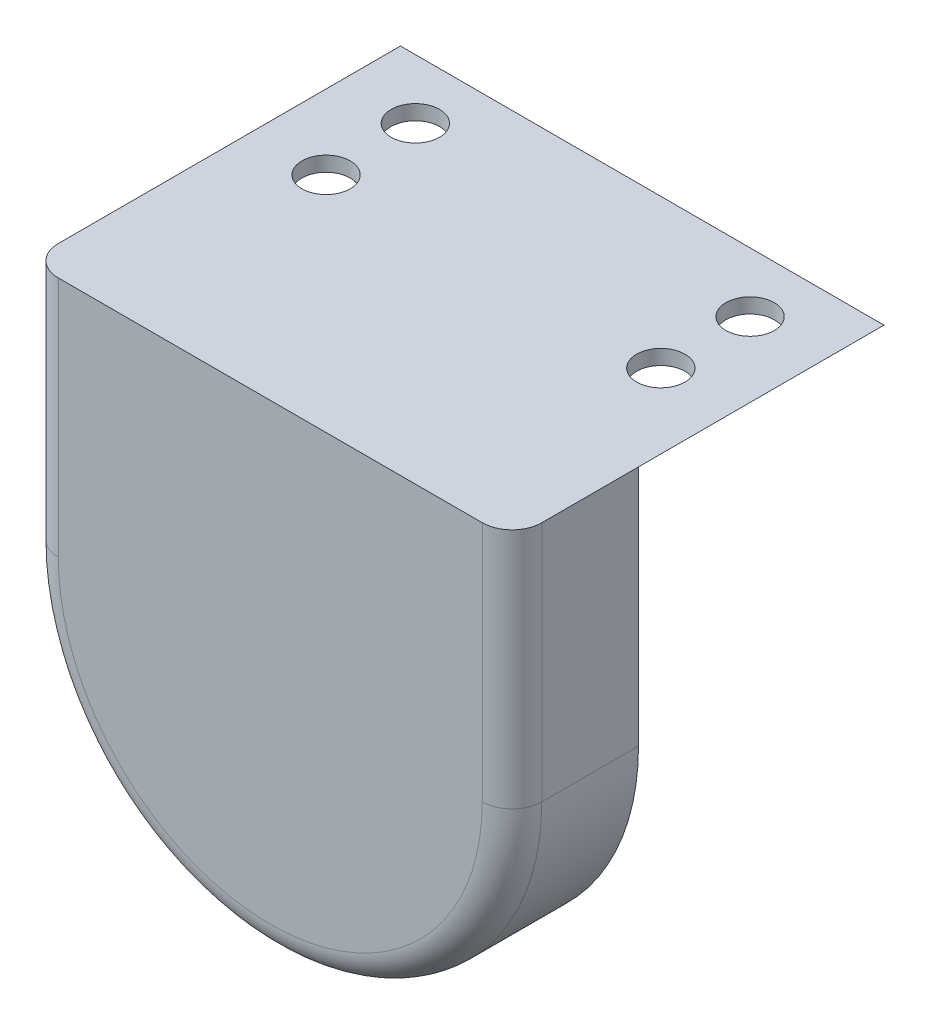
ISO-10303-21;
HEADER;
FILE_DESCRIPTION(('STEP AP214'),'2;1');
FILE_NAME('part.step','',(''),(''),'','','');
FILE_SCHEMA(('AUTOMOTIVE_DESIGN { 1 0 10303 214 1 1 1 1 }'));
ENDSEC;
DATA;
#1=APPLICATION_CONTEXT('core data for automotive mechanical design processes');
#2=APPLICATION_PROTOCOL_DEFINITION('international standard','automotive_design',2000,#1);
#3=PRODUCT_CONTEXT('',#1,'mechanical');
#4=PRODUCT('Part','Part','',(#3));
#5=PRODUCT_RELATED_PRODUCT_CATEGORY('part','',(#4));
#6=PRODUCT_DEFINITION_FORMATION('','',#4);
#7=PRODUCT_DEFINITION_CONTEXT('part definition',#1,'design');
#8=PRODUCT_DEFINITION('design','',#6,#7);
#9=PRODUCT_DEFINITION_SHAPE('','',#8);
#10=(LENGTH_UNIT() NAMED_UNIT(*) SI_UNIT(.MILLI.,.METRE.));
#11=(NAMED_UNIT(*) PLANE_ANGLE_UNIT() SI_UNIT($,.RADIAN.));
#12=(NAMED_UNIT(*) SI_UNIT($,.STERADIAN.) SOLID_ANGLE_UNIT());
#13=UNCERTAINTY_MEASURE_WITH_UNIT(LENGTH_MEASURE(1.E-05),#10,'distance_accuracy_value','');
#14=(GEOMETRIC_REPRESENTATION_CONTEXT(3) GLOBAL_UNCERTAINTY_ASSIGNED_CONTEXT((#13)) GLOBAL_UNIT_ASSIGNED_CONTEXT((#10,
#11,#12)) REPRESENTATION_CONTEXT('',''));
#15=CARTESIAN_POINT('',(0.,0.,0.));
#16=DIRECTION('',(0.,0.,1.));
#17=DIRECTION('',(1.,0.,0.));
#18=AXIS2_PLACEMENT_3D('',#15,#16,#17);
#19=CARTESIAN_POINT('',(-32.5,-50.,23.));
#20=DIRECTION('',(0.,0.,1.));
#21=DIRECTION('',(1.,0.,0.));
#22=AXIS2_PLACEMENT_3D('',#19,#20,#21);
#23=PLANE('',#22);
#24=DIRECTION('',(1.,0.,0.));
#25=VECTOR('',#24,1.);
#26=CARTESIAN_POINT('',(-32.5,-2.,23.));
#27=LINE('',#26,#25);
#28=CARTESIAN_POINT('',(-28.5,-2.,23.));
#29=VERTEX_POINT('',#28);
#30=CARTESIAN_POINT('',(28.5,-2.,23.));
#31=VERTEX_POINT('',#30);
#32=EDGE_CURVE('E133',#29,#31,#27,.T.);
#33=ORIENTED_EDGE('',*,*,#32,.T.);
#34=DIRECTION('',(0.,-1.,0.));
#35=VECTOR('',#34,1.);
#36=CARTESIAN_POINT('',(28.5,-50.,23.));
#37=LINE('',#36,#35);
#38=CARTESIAN_POINT('',(28.5,-32.5,23.));
#39=VERTEX_POINT('',#38);
#40=EDGE_CURVE('E207',#31,#39,#37,.T.);
#41=ORIENTED_EDGE('',*,*,#40,.T.);
#42=CARTESIAN_POINT('',(0.,-32.5,23.));
#43=DIRECTION('',(0.,0.,1.));
#44=DIRECTION('',(1.,0.,0.));
#45=AXIS2_PLACEMENT_3D('',#42,#43,#44);
#46=CIRCLE('',#45,28.5);
#47=CARTESIAN_POINT('',(-28.5,-32.5,23.));
#48=VERTEX_POINT('',#47);
#49=EDGE_CURVE('E204',#39,#48,#46,.F.);
#50=ORIENTED_EDGE('',*,*,#49,.T.);
#51=DIRECTION('',(0.,1.,0.));
#52=VECTOR('',#51,1.);
#53=CARTESIAN_POINT('',(-28.5,-50.,23.));
#54=LINE('',#53,#52);
#55=EDGE_CURVE('E209',#48,#29,#54,.T.);
#56=ORIENTED_EDGE('',*,*,#55,.T.);
#57=EDGE_LOOP('',(#33,#41,#50,#56));
#58=FACE_BOUND('',#57,.T.);
#59=ADVANCED_FACE('F18',(#58),#23,.F.);
#60=CARTESIAN_POINT('',(32.5,-50.,23.));
#61=DIRECTION('',(-1.,0.,0.));
#62=DIRECTION('',(0.,0.,1.));
#63=AXIS2_PLACEMENT_3D('',#60,#61,#62);
#64=PLANE('',#63);
#65=DIRECTION('',(0.,-1.,0.));
#66=VECTOR('',#65,1.);
#67=CARTESIAN_POINT('',(32.5,-32.5,8.));
#68=LINE('',#67,#66);
#69=CARTESIAN_POINT('',(32.5,0.,8.));
#70=VERTEX_POINT('',#69);
#71=CARTESIAN_POINT('',(32.5,-32.5,8.));
#72=VERTEX_POINT('',#71);
#73=EDGE_CURVE('E35',#70,#72,#68,.T.);
#74=ORIENTED_EDGE('',*,*,#73,.F.);
#75=DIRECTION('',(0.,0.,1.));
#76=VECTOR('',#75,1.);
#77=CARTESIAN_POINT('',(32.5,0.,23.));
#78=LINE('',#77,#76);
#79=CARTESIAN_POINT('',(32.5,0.,21.));
#80=VERTEX_POINT('',#79);
#81=EDGE_CURVE('E179',#70,#80,#78,.T.);
#82=ORIENTED_EDGE('',*,*,#81,.T.);
#83=DIRECTION('',(0.,-1.,0.));
#84=VECTOR('',#83,1.);
#85=CARTESIAN_POINT('',(32.5,-50.,21.));
#86=LINE('',#85,#84);
#87=CARTESIAN_POINT('',(32.5,-32.5,21.));
#88=VERTEX_POINT('',#87);
#89=EDGE_CURVE('E251',#80,#88,#86,.T.);
#90=ORIENTED_EDGE('',*,*,#89,.T.);
#91=DIRECTION('',(0.,0.,1.));
#92=VECTOR('',#91,1.);
#93=CARTESIAN_POINT('',(32.5,-32.5,23.));
#94=LINE('',#93,#92);
#95=EDGE_CURVE('E132',#88,#72,#94,.F.);
#96=ORIENTED_EDGE('',*,*,#95,.T.);
#97=EDGE_LOOP('',(#74,#82,#90,#96));
#98=FACE_BOUND('',#97,.T.);
#99=ADVANCED_FACE('F381',(#98),#64,.F.);
#100=CARTESIAN_POINT('',(32.5,-50.,25.));
#101=DIRECTION('',(0.,0.,-1.));
#102=DIRECTION('',(-1.,0.,0.));
#103=AXIS2_PLACEMENT_3D('',#100,#101,#102);
#104=PLANE('',#103);
#105=CARTESIAN_POINT('',(0.,-32.5,25.));
#106=DIRECTION('',(0.,0.,-1.));
#107=DIRECTION('',(-1.,0.,0.));
#108=AXIS2_PLACEMENT_3D('',#105,#106,#107);
#109=CIRCLE('',#108,28.5);
#110=CARTESIAN_POINT('',(-28.5,-32.5,25.));
#111=VERTEX_POINT('',#110);
#112=CARTESIAN_POINT('',(28.5,-32.5,25.));
#113=VERTEX_POINT('',#112);
#114=EDGE_CURVE('E201',#111,#113,#109,.F.);
#115=ORIENTED_EDGE('',*,*,#114,.T.);
#116=DIRECTION('',(0.,-1.,0.));
#117=VECTOR('',#116,1.);
#118=CARTESIAN_POINT('',(28.5,-50.,25.));
#119=LINE('',#118,#117);
#120=CARTESIAN_POINT('',(28.5,0.,25.));
#121=VERTEX_POINT('',#120);
#122=EDGE_CURVE('E239',#113,#121,#119,.F.);
#123=ORIENTED_EDGE('',*,*,#122,.T.);
#124=DIRECTION('',(-1.,0.,0.));
#125=VECTOR('',#124,1.);
#126=CARTESIAN_POINT('',(32.5,0.,25.));
#127=LINE('',#126,#125);
#128=CARTESIAN_POINT('',(-28.5,0.,25.));
#129=VERTEX_POINT('',#128);
#130=EDGE_CURVE('E182',#121,#129,#127,.T.);
#131=ORIENTED_EDGE('',*,*,#130,.T.);
#132=DIRECTION('',(0.,1.,0.));
#133=VECTOR('',#132,1.);
#134=CARTESIAN_POINT('',(-28.5,-50.,25.));
#135=LINE('',#134,#133);
#136=EDGE_CURVE('E240',#129,#111,#135,.F.);
#137=ORIENTED_EDGE('',*,*,#136,.T.);
#138=EDGE_LOOP('',(#115,#123,#131,#137));
#139=FACE_BOUND('',#138,.T.);
#140=ADVANCED_FACE('F386',(#139),#104,.F.);
#141=CARTESIAN_POINT('',(-32.5,-50.,25.));
#142=DIRECTION('',(1.,0.,0.));
#143=DIRECTION('',(0.,0.,-1.));
#144=AXIS2_PLACEMENT_3D('',#141,#142,#143);
#145=PLANE('',#144);
#146=DIRECTION('',(0.,0.,-1.));
#147=VECTOR('',#146,1.);
#148=CARTESIAN_POINT('',(-32.5,0.,25.));
#149=LINE('',#148,#147);
#150=CARTESIAN_POINT('',(-32.5,0.,21.));
#151=VERTEX_POINT('',#150);
#152=CARTESIAN_POINT('',(-32.5,0.,8.));
#153=VERTEX_POINT('',#152);
#154=EDGE_CURVE('E139',#151,#153,#149,.T.);
#155=ORIENTED_EDGE('',*,*,#154,.T.);
#156=DIRECTION('',(0.,1.,0.));
#157=VECTOR('',#156,1.);
#158=CARTESIAN_POINT('',(-32.5,-32.5,8.));
#159=LINE('',#158,#157);
#160=CARTESIAN_POINT('',(-32.5,-32.5,8.));
#161=VERTEX_POINT('',#160);
#162=EDGE_CURVE('E136',#161,#153,#159,.T.);
#163=ORIENTED_EDGE('',*,*,#162,.F.);
#164=DIRECTION('',(0.,0.,-1.));
#165=VECTOR('',#164,1.);
#166=CARTESIAN_POINT('',(-32.5,-32.5,25.));
#167=LINE('',#166,#165);
#168=CARTESIAN_POINT('',(-32.5,-32.5,21.));
#169=VERTEX_POINT('',#168);
#170=EDGE_CURVE('E121',#161,#169,#167,.F.);
#171=ORIENTED_EDGE('',*,*,#170,.T.);
#172=DIRECTION('',(0.,1.,0.));
#173=VECTOR('',#172,1.);
#174=CARTESIAN_POINT('',(-32.5,-50.,21.));
#175=LINE('',#174,#173);
#176=EDGE_CURVE('E254',#169,#151,#175,.T.);
#177=ORIENTED_EDGE('',*,*,#176,.T.);
#178=EDGE_LOOP('',(#155,#163,#171,#177));
#179=FACE_BOUND('',#178,.T.);
#180=ADVANCED_FACE('F137',(#179),#145,.F.);
#181=CARTESIAN_POINT('',(0.,0.,0.));
#182=DIRECTION('',(0.,-1.,0.));
#183=DIRECTION('',(0.,0.,-1.));
#184=AXIS2_PLACEMENT_3D('',#181,#182,#183);
#185=PLANE('',#184);
#186=CARTESIAN_POINT('',(-22.5,0.,-17.));
#187=DIRECTION('',(0.,-1.,0.));
#188=DIRECTION('',(0.,0.,-1.));
#189=AXIS2_PLACEMENT_3D('',#186,#187,#188);
#190=CIRCLE('',#189,3.25);
#191=CARTESIAN_POINT('',(-22.5,0.,-20.25));
#192=VERTEX_POINT('',#191);
#193=EDGE_CURVE('E279',#192,#192,#190,.F.);
#194=ORIENTED_EDGE('',*,*,#193,.F.);
#195=EDGE_LOOP('',(#194));
#196=FACE_BOUND('',#195,.T.);
#197=CARTESIAN_POINT('',(-22.5,0.,-5.));
#198=DIRECTION('',(0.,-1.,0.));
#199=DIRECTION('',(0.,0.,-1.));
#200=AXIS2_PLACEMENT_3D('',#197,#198,#199);
#201=CIRCLE('',#200,3.25);
#202=CARTESIAN_POINT('',(-22.5,0.,-8.25));
#203=VERTEX_POINT('',#202);
#204=EDGE_CURVE('E294',#203,#203,#201,.F.);
#205=ORIENTED_EDGE('',*,*,#204,.F.);
#206=EDGE_LOOP('',(#205));
#207=FACE_BOUND('',#206,.T.);
#208=CARTESIAN_POINT('',(22.5,0.,-17.));
#209=DIRECTION('',(0.,-1.,0.));
#210=DIRECTION('',(0.,0.,-1.));
#211=AXIS2_PLACEMENT_3D('',#208,#209,#210);
#212=CIRCLE('',#211,3.25);
#213=CARTESIAN_POINT('',(22.5,0.,-20.25));
#214=VERTEX_POINT('',#213);
#215=EDGE_CURVE('E293',#214,#214,#212,.F.);
#216=ORIENTED_EDGE('',*,*,#215,.F.);
#217=EDGE_LOOP('',(#216));
#218=FACE_BOUND('',#217,.T.);
#219=CARTESIAN_POINT('',(22.5,0.,-5.));
#220=DIRECTION('',(0.,-1.,0.));
#221=DIRECTION('',(0.,0.,-1.));
#222=AXIS2_PLACEMENT_3D('',#219,#220,#221);
#223=CIRCLE('',#222,3.25);
#224=CARTESIAN_POINT('',(22.5,0.,-8.25));
#225=VERTEX_POINT('',#224);
#226=EDGE_CURVE('E234',#225,#225,#223,.F.);
#227=ORIENTED_EDGE('',*,*,#226,.F.);
#228=EDGE_LOOP('',(#227));
#229=FACE_BOUND('',#228,.T.);
#230=ORIENTED_EDGE('',*,*,#130,.F.);
#231=CARTESIAN_POINT('',(28.5,0.,21.));
#232=DIRECTION('',(0.,-1.,0.));
#233=DIRECTION('',(0.,0.,-1.));
#234=AXIS2_PLACEMENT_3D('',#231,#232,#233);
#235=CIRCLE('',#234,4.);
#236=EDGE_CURVE('E238',#121,#80,#235,.F.);
#237=ORIENTED_EDGE('',*,*,#236,.T.);
#238=ORIENTED_EDGE('',*,*,#81,.F.);
#239=CARTESIAN_POINT('',(32.5,0.,-25.));
#240=VERTEX_POINT('',#239);
#241=EDGE_CURVE('E187',#240,#70,#78,.T.);
#242=ORIENTED_EDGE('',*,*,#241,.F.);
#243=DIRECTION('',(1.,0.,0.));
#244=VECTOR('',#243,1.);
#245=CARTESIAN_POINT('',(-32.5,0.,-25.));
#246=LINE('',#245,#244);
#247=CARTESIAN_POINT('',(-32.5,0.,-25.));
#248=VERTEX_POINT('',#247);
#249=EDGE_CURVE('E175',#248,#240,#246,.T.);
#250=ORIENTED_EDGE('',*,*,#249,.F.);
#251=EDGE_CURVE('E186',#153,#248,#149,.T.);
#252=ORIENTED_EDGE('',*,*,#251,.F.);
#253=ORIENTED_EDGE('',*,*,#154,.F.);
#254=CARTESIAN_POINT('',(-28.5,0.,21.));
#255=DIRECTION('',(0.,-1.,0.));
#256=DIRECTION('',(0.,0.,-1.));
#257=AXIS2_PLACEMENT_3D('',#254,#255,#256);
#258=CIRCLE('',#257,4.);
#259=EDGE_CURVE('E235',#151,#129,#258,.F.);
#260=ORIENTED_EDGE('',*,*,#259,.T.);
#261=EDGE_LOOP('',(#230,#237,#238,#242,#250,#252,#253,#260));
#262=FACE_BOUND('',#261,.T.);
#263=ADVANCED_FACE('F361',(#196,#207,#218,#229,#262),#185,.F.);
#264=CARTESIAN_POINT('',(0.,-2.,0.));
#265=DIRECTION('',(0.,-1.,0.));
#266=DIRECTION('',(0.,0.,-1.));
#267=AXIS2_PLACEMENT_3D('',#264,#265,#266);
#268=PLANE('',#267);
#269=CARTESIAN_POINT('',(-22.5,-2.,-17.));
#270=DIRECTION('',(0.,1.,0.));
#271=DIRECTION('',(1.,0.,0.));
#272=AXIS2_PLACEMENT_3D('',#269,#270,#271);
#273=CIRCLE('',#272,3.25);
#274=CARTESIAN_POINT('',(-19.25,-2.,-17.));
#275=VERTEX_POINT('',#274);
#276=EDGE_CURVE('E276',#275,#275,#273,.T.);
#277=ORIENTED_EDGE('',*,*,#276,.T.);
#278=EDGE_LOOP('',(#277));
#279=FACE_BOUND('',#278,.T.);
#280=CARTESIAN_POINT('',(-22.5,-2.,-5.));
#281=DIRECTION('',(0.,1.,0.));
#282=DIRECTION('',(1.,0.,0.));
#283=AXIS2_PLACEMENT_3D('',#280,#281,#282);
#284=CIRCLE('',#283,3.25);
#285=CARTESIAN_POINT('',(-19.25,-2.,-5.));
#286=VERTEX_POINT('',#285);
#287=EDGE_CURVE('E314',#286,#286,#284,.T.);
#288=ORIENTED_EDGE('',*,*,#287,.T.);
#289=EDGE_LOOP('',(#288));
#290=FACE_BOUND('',#289,.T.);
#291=CARTESIAN_POINT('',(22.5,-2.,-17.));
#292=DIRECTION('',(0.,1.,0.));
#293=DIRECTION('',(-1.,0.,0.));
#294=AXIS2_PLACEMENT_3D('',#291,#292,#293);
#295=CIRCLE('',#294,3.25);
#296=CARTESIAN_POINT('',(19.25,-2.,-17.));
#297=VERTEX_POINT('',#296);
#298=EDGE_CURVE('E290',#297,#297,#295,.T.);
#299=ORIENTED_EDGE('',*,*,#298,.T.);
#300=EDGE_LOOP('',(#299));
#301=FACE_BOUND('',#300,.T.);
#302=CARTESIAN_POINT('',(22.5,-2.,-5.));
#303=DIRECTION('',(0.,1.,0.));
#304=DIRECTION('',(1.,0.,0.));
#305=AXIS2_PLACEMENT_3D('',#302,#303,#304);
#306=CIRCLE('',#305,3.25);
#307=CARTESIAN_POINT('',(25.75,-2.,-5.));
#308=VERTEX_POINT('',#307);
#309=EDGE_CURVE('E311',#308,#308,#306,.T.);
#310=ORIENTED_EDGE('',*,*,#309,.T.);
#311=EDGE_LOOP('',(#310));
#312=FACE_BOUND('',#311,.T.);
#313=DIRECTION('',(1.,0.,0.));
#314=VECTOR('',#313,1.);
#315=CARTESIAN_POINT('',(-32.5,-2.,-25.));
#316=LINE('',#315,#314);
#317=CARTESIAN_POINT('',(-30.5,-2.,-25.));
#318=VERTEX_POINT('',#317);
#319=CARTESIAN_POINT('',(30.5,-2.,-25.));
#320=VERTEX_POINT('',#319);
#321=EDGE_CURVE('E176',#318,#320,#316,.T.);
#322=ORIENTED_EDGE('',*,*,#321,.T.);
#323=DIRECTION('',(0.,0.,1.));
#324=VECTOR('',#323,1.);
#325=CARTESIAN_POINT('',(30.5,-2.,8.));
#326=LINE('',#325,#324);
#327=CARTESIAN_POINT('',(30.5,-2.,8.));
#328=VERTEX_POINT('',#327);
#329=EDGE_CURVE('E269',#320,#328,#326,.T.);
#330=ORIENTED_EDGE('',*,*,#329,.T.);
#331=DIRECTION('',(0.,0.,1.));
#332=VECTOR('',#331,1.);
#333=CARTESIAN_POINT('',(30.5,-2.,8.));
#334=LINE('',#333,#332);
#335=CARTESIAN_POINT('',(30.5,-2.,21.));
#336=VERTEX_POINT('',#335);
#337=EDGE_CURVE('E160',#328,#336,#334,.T.);
#338=ORIENTED_EDGE('',*,*,#337,.T.);
#339=CARTESIAN_POINT('',(28.5,-2.,21.));
#340=DIRECTION('',(0.,-1.,0.));
#341=DIRECTION('',(0.,0.,-1.));
#342=AXIS2_PLACEMENT_3D('',#339,#340,#341);
#343=CIRCLE('',#342,2.);
#344=EDGE_CURVE('E208',#336,#31,#343,.T.);
#345=ORIENTED_EDGE('',*,*,#344,.T.);
#346=ORIENTED_EDGE('',*,*,#32,.F.);
#347=CARTESIAN_POINT('',(-28.5,-2.,21.));
#348=DIRECTION('',(0.,-1.,0.));
#349=DIRECTION('',(0.,0.,-1.));
#350=AXIS2_PLACEMENT_3D('',#347,#348,#349);
#351=CIRCLE('',#350,2.);
#352=CARTESIAN_POINT('',(-30.5,-2.,21.));
#353=VERTEX_POINT('',#352);
#354=EDGE_CURVE('E212',#29,#353,#351,.T.);
#355=ORIENTED_EDGE('',*,*,#354,.T.);
#356=DIRECTION('',(0.,0.,1.));
#357=VECTOR('',#356,1.);
#358=CARTESIAN_POINT('',(-30.5,-2.,8.));
#359=LINE('',#358,#357);
#360=CARTESIAN_POINT('',(-30.5,-2.,8.));
#361=VERTEX_POINT('',#360);
#362=EDGE_CURVE('E171',#361,#353,#359,.T.);
#363=ORIENTED_EDGE('',*,*,#362,.F.);
#364=DIRECTION('',(0.,0.,-1.));
#365=VECTOR('',#364,1.);
#366=CARTESIAN_POINT('',(-30.5,-2.,-25.));
#367=LINE('',#366,#365);
#368=EDGE_CURVE('E257',#361,#318,#367,.T.);
#369=ORIENTED_EDGE('',*,*,#368,.T.);
#370=EDGE_LOOP('',(#322,#330,#338,#345,#346,#355,#363,#369));
#371=FACE_BOUND('',#370,.T.);
#372=ADVANCED_FACE('F365',(#279,#290,#301,#312,#371),#268,.T.);
#373=CARTESIAN_POINT('',(-32.5,-2.,-25.));
#374=DIRECTION('',(0.,0.,1.));
#375=DIRECTION('',(1.,0.,0.));
#376=AXIS2_PLACEMENT_3D('',#373,#374,#375);
#377=PLANE('',#376);
#378=ORIENTED_EDGE('',*,*,#249,.T.);
#379=DIRECTION('',(-0.707106781186548,-0.707106781186547,0.));
#380=VECTOR('',#379,1.);
#381=CARTESIAN_POINT('',(30.5,-2.,-25.));
#382=LINE('',#381,#380);
#383=EDGE_CURVE('E28',#240,#320,#382,.T.);
#384=ORIENTED_EDGE('',*,*,#383,.T.);
#385=ORIENTED_EDGE('',*,*,#321,.F.);
#386=DIRECTION('',(-0.707106781186548,0.707106781186547,0.));
#387=VECTOR('',#386,1.);
#388=CARTESIAN_POINT('',(-30.5,-2.,-25.));
#389=LINE('',#388,#387);
#390=EDGE_CURVE('E263',#318,#248,#389,.T.);
#391=ORIENTED_EDGE('',*,*,#390,.T.);
#392=EDGE_LOOP('',(#378,#384,#385,#391));
#393=FACE_BOUND('',#392,.T.);
#394=ADVANCED_FACE('F366',(#393),#377,.F.);
#395=CARTESIAN_POINT('',(0.,-32.5,0.));
#396=DIRECTION('',(0.,0.,1.));
#397=DIRECTION('',(1.,0.,0.));
#398=AXIS2_PLACEMENT_3D('',#395,#396,#397);
#399=CYLINDRICAL_SURFACE('',#398,32.5);
#400=ORIENTED_EDGE('',*,*,#95,.F.);
#401=CARTESIAN_POINT('',(0.,-32.5,21.));
#402=DIRECTION('',(0.,0.,-1.));
#403=DIRECTION('',(-1.,0.,0.));
#404=AXIS2_PLACEMENT_3D('',#401,#402,#403);
#405=CIRCLE('',#404,32.5);
#406=EDGE_CURVE('E128',#88,#169,#405,.T.);
#407=ORIENTED_EDGE('',*,*,#406,.T.);
#408=ORIENTED_EDGE('',*,*,#170,.F.);
#409=CARTESIAN_POINT('',(0.,-32.5,8.));
#410=DIRECTION('',(0.,0.,-1.));
#411=DIRECTION('',(1.,0.,0.));
#412=AXIS2_PLACEMENT_3D('',#409,#410,#411);
#413=CIRCLE('',#412,32.5);
#414=EDGE_CURVE('E126',#72,#161,#413,.T.);
#415=ORIENTED_EDGE('',*,*,#414,.F.);
#416=EDGE_LOOP('',(#400,#407,#408,#415));
#417=FACE_BOUND('',#416,.T.);
#418=ADVANCED_FACE('F124',(#417),#399,.T.);
#419=CARTESIAN_POINT('',(-30.5,-2.,8.));
#420=DIRECTION('',(-1.,0.,0.));
#421=DIRECTION('',(0.,-1.,0.));
#422=AXIS2_PLACEMENT_3D('',#419,#420,#421);
#423=PLANE('',#422);
#424=ORIENTED_EDGE('',*,*,#362,.T.);
#425=DIRECTION('',(0.,1.,0.));
#426=VECTOR('',#425,1.);
#427=CARTESIAN_POINT('',(-30.5,-50.,21.));
#428=LINE('',#427,#426);
#429=CARTESIAN_POINT('',(-30.5,-32.5,21.));
#430=VERTEX_POINT('',#429);
#431=EDGE_CURVE('E198',#353,#430,#428,.F.);
#432=ORIENTED_EDGE('',*,*,#431,.T.);
#433=DIRECTION('',(0.,0.,1.));
#434=VECTOR('',#433,1.);
#435=CARTESIAN_POINT('',(-30.5,-32.5,8.));
#436=LINE('',#435,#434);
#437=CARTESIAN_POINT('',(-30.5,-32.5,8.));
#438=VERTEX_POINT('',#437);
#439=EDGE_CURVE('E168',#438,#430,#436,.T.);
#440=ORIENTED_EDGE('',*,*,#439,.F.);
#441=DIRECTION('',(0.,-1.,0.));
#442=VECTOR('',#441,1.);
#443=CARTESIAN_POINT('',(-30.5,-2.,8.));
#444=LINE('',#443,#442);
#445=EDGE_CURVE('E144',#361,#438,#444,.T.);
#446=ORIENTED_EDGE('',*,*,#445,.F.);
#447=EDGE_LOOP('',(#424,#432,#440,#446));
#448=FACE_BOUND('',#447,.T.);
#449=ADVANCED_FACE('F346',(#448),#423,.F.);
#450=CARTESIAN_POINT('',(0.,-32.5,8.));
#451=DIRECTION('',(0.,0.,1.));
#452=DIRECTION('',(1.,0.,0.));
#453=AXIS2_PLACEMENT_3D('',#450,#451,#452);
#454=CYLINDRICAL_SURFACE('',#453,30.5);
#455=ORIENTED_EDGE('',*,*,#439,.T.);
#456=CARTESIAN_POINT('',(0.,-32.5,21.));
#457=DIRECTION('',(0.,0.,1.));
#458=DIRECTION('',(1.,0.,0.));
#459=AXIS2_PLACEMENT_3D('',#456,#457,#458);
#460=CIRCLE('',#459,30.5);
#461=CARTESIAN_POINT('',(30.5,-32.5,21.));
#462=VERTEX_POINT('',#461);
#463=EDGE_CURVE('E202',#430,#462,#460,.T.);
#464=ORIENTED_EDGE('',*,*,#463,.T.);
#465=DIRECTION('',(0.,0.,1.));
#466=VECTOR('',#465,1.);
#467=CARTESIAN_POINT('',(30.5,-32.5,8.));
#468=LINE('',#467,#466);
#469=CARTESIAN_POINT('',(30.5,-32.5,8.));
#470=VERTEX_POINT('',#469);
#471=EDGE_CURVE('E164',#470,#462,#468,.T.);
#472=ORIENTED_EDGE('',*,*,#471,.F.);
#473=CARTESIAN_POINT('',(0.,-32.5,8.));
#474=DIRECTION('',(0.,0.,1.));
#475=DIRECTION('',(-1.,0.,0.));
#476=AXIS2_PLACEMENT_3D('',#473,#474,#475);
#477=CIRCLE('',#476,30.5);
#478=EDGE_CURVE('E301',#438,#470,#477,.T.);
#479=ORIENTED_EDGE('',*,*,#478,.F.);
#480=EDGE_LOOP('',(#455,#464,#472,#479));
#481=FACE_BOUND('',#480,.T.);
#482=ADVANCED_FACE('F350',(#481),#454,.F.);
#483=CARTESIAN_POINT('',(30.5,-32.5,8.));
#484=DIRECTION('',(1.,0.,0.));
#485=DIRECTION('',(0.,1.,0.));
#486=AXIS2_PLACEMENT_3D('',#483,#484,#485);
#487=PLANE('',#486);
#488=ORIENTED_EDGE('',*,*,#471,.T.);
#489=DIRECTION('',(0.,-1.,0.));
#490=VECTOR('',#489,1.);
#491=CARTESIAN_POINT('',(30.5,-50.,21.));
#492=LINE('',#491,#490);
#493=EDGE_CURVE('E214',#462,#336,#492,.F.);
#494=ORIENTED_EDGE('',*,*,#493,.T.);
#495=ORIENTED_EDGE('',*,*,#337,.F.);
#496=DIRECTION('',(0.,1.,0.));
#497=VECTOR('',#496,1.);
#498=CARTESIAN_POINT('',(30.5,-32.5,8.));
#499=LINE('',#498,#497);
#500=EDGE_CURVE('E299',#470,#328,#499,.T.);
#501=ORIENTED_EDGE('',*,*,#500,.F.);
#502=EDGE_LOOP('',(#488,#494,#495,#501));
#503=FACE_BOUND('',#502,.T.);
#504=ADVANCED_FACE('F355',(#503),#487,.F.);
#505=CARTESIAN_POINT('',(0.,-32.5,8.));
#506=DIRECTION('',(0.,0.,-1.));
#507=DIRECTION('',(-1.,0.,0.));
#508=AXIS2_PLACEMENT_3D('',#505,#506,#507);
#509=PLANE('',#508);
#510=ORIENTED_EDGE('',*,*,#414,.T.);
#511=ORIENTED_EDGE('',*,*,#162,.T.);
#512=DIRECTION('',(0.707106781186548,-0.707106781186547,0.));
#513=VECTOR('',#512,1.);
#514=CARTESIAN_POINT('',(-30.5,-2.,8.));
#515=LINE('',#514,#513);
#516=EDGE_CURVE('E266',#153,#361,#515,.T.);
#517=ORIENTED_EDGE('',*,*,#516,.T.);
#518=ORIENTED_EDGE('',*,*,#445,.T.);
#519=ORIENTED_EDGE('',*,*,#478,.T.);
#520=ORIENTED_EDGE('',*,*,#500,.T.);
#521=DIRECTION('',(0.707106781186548,0.707106781186547,0.));
#522=VECTOR('',#521,1.);
#523=CARTESIAN_POINT('',(30.5,-2.,8.));
#524=LINE('',#523,#522);
#525=EDGE_CURVE('E11',#328,#70,#524,.T.);
#526=ORIENTED_EDGE('',*,*,#525,.T.);
#527=ORIENTED_EDGE('',*,*,#73,.T.);
#528=EDGE_LOOP('',(#510,#511,#517,#518,#519,#520,#526,#527));
#529=FACE_BOUND('',#528,.T.);
#530=ADVANCED_FACE('F146',(#529),#509,.T.);
#531=CARTESIAN_POINT('',(-28.5,-50.,21.));
#532=DIRECTION('',(0.,-1.,0.));
#533=DIRECTION('',(1.,0.,0.));
#534=AXIS2_PLACEMENT_3D('',#531,#532,#533);
#535=CYLINDRICAL_SURFACE('',#534,2.);
#536=ORIENTED_EDGE('',*,*,#55,.F.);
#537=CARTESIAN_POINT('',(-28.5,-32.5,21.));
#538=DIRECTION('',(0.,-1.,0.));
#539=DIRECTION('',(0.,0.,-1.));
#540=AXIS2_PLACEMENT_3D('',#537,#538,#539);
#541=CIRCLE('',#540,2.);
#542=EDGE_CURVE('E199',#48,#430,#541,.T.);
#543=ORIENTED_EDGE('',*,*,#542,.T.);
#544=ORIENTED_EDGE('',*,*,#431,.F.);
#545=ORIENTED_EDGE('',*,*,#354,.F.);
#546=EDGE_LOOP('',(#536,#543,#544,#545));
#547=FACE_BOUND('',#546,.T.);
#548=ADVANCED_FACE('F402',(#547),#535,.F.);
#549=CARTESIAN_POINT('',(0.,-32.5,21.));
#550=DIRECTION('',(0.,0.,1.));
#551=DIRECTION('',(1.,0.,0.));
#552=AXIS2_PLACEMENT_3D('',#549,#550,#551);
#553=TOROIDAL_SURFACE('',#552,28.5,2.);
#554=ORIENTED_EDGE('',*,*,#542,.F.);
#555=ORIENTED_EDGE('',*,*,#49,.F.);
#556=CARTESIAN_POINT('',(28.5,-32.5,21.));
#557=DIRECTION('',(0.,1.,0.));
#558=DIRECTION('',(-1.,0.,0.));
#559=AXIS2_PLACEMENT_3D('',#556,#557,#558);
#560=CIRCLE('',#559,2.);
#561=EDGE_CURVE('E148',#462,#39,#560,.F.);
#562=ORIENTED_EDGE('',*,*,#561,.F.);
#563=ORIENTED_EDGE('',*,*,#463,.F.);
#564=EDGE_LOOP('',(#554,#555,#562,#563));
#565=FACE_BOUND('',#564,.T.);
#566=ADVANCED_FACE('F398',(#565),#553,.F.);
#567=CARTESIAN_POINT('',(28.5,-50.,21.));
#568=DIRECTION('',(0.,1.,0.));
#569=DIRECTION('',(-1.,0.,0.));
#570=AXIS2_PLACEMENT_3D('',#567,#568,#569);
#571=CYLINDRICAL_SURFACE('',#570,2.);
#572=ORIENTED_EDGE('',*,*,#561,.T.);
#573=ORIENTED_EDGE('',*,*,#40,.F.);
#574=ORIENTED_EDGE('',*,*,#344,.F.);
#575=ORIENTED_EDGE('',*,*,#493,.F.);
#576=EDGE_LOOP('',(#572,#573,#574,#575));
#577=FACE_BOUND('',#576,.T.);
#578=ADVANCED_FACE('F401',(#577),#571,.F.);
#579=CARTESIAN_POINT('',(-28.5,-50.,21.));
#580=DIRECTION('',(0.,1.,0.));
#581=DIRECTION('',(0.,0.,1.));
#582=AXIS2_PLACEMENT_3D('',#579,#580,#581);
#583=CYLINDRICAL_SURFACE('',#582,4.);
#584=ORIENTED_EDGE('',*,*,#259,.F.);
#585=ORIENTED_EDGE('',*,*,#176,.F.);
#586=CARTESIAN_POINT('',(-28.5,-32.5,21.));
#587=DIRECTION('',(0.,1.,0.));
#588=DIRECTION('',(0.,0.,1.));
#589=AXIS2_PLACEMENT_3D('',#586,#587,#588);
#590=CIRCLE('',#589,4.);
#591=EDGE_CURVE('E155',#111,#169,#590,.F.);
#592=ORIENTED_EDGE('',*,*,#591,.F.);
#593=ORIENTED_EDGE('',*,*,#136,.F.);
#594=EDGE_LOOP('',(#584,#585,#592,#593));
#595=FACE_BOUND('',#594,.T.);
#596=ADVANCED_FACE('F409',(#595),#583,.T.);
#597=CARTESIAN_POINT('',(0.,-32.5,21.));
#598=DIRECTION('',(0.,0.,-1.));
#599=DIRECTION('',(-1.,0.,0.));
#600=AXIS2_PLACEMENT_3D('',#597,#598,#599);
#601=TOROIDAL_SURFACE('',#600,28.5,4.);
#602=ORIENTED_EDGE('',*,*,#591,.T.);
#603=ORIENTED_EDGE('',*,*,#406,.F.);
#604=CARTESIAN_POINT('',(28.5,-32.5,21.));
#605=DIRECTION('',(0.,-1.,0.));
#606=DIRECTION('',(0.,0.,-1.));
#607=AXIS2_PLACEMENT_3D('',#604,#605,#606);
#608=CIRCLE('',#607,4.);
#609=EDGE_CURVE('E230',#113,#88,#608,.F.);
#610=ORIENTED_EDGE('',*,*,#609,.F.);
#611=ORIENTED_EDGE('',*,*,#114,.F.);
#612=EDGE_LOOP('',(#602,#603,#610,#611));
#613=FACE_BOUND('',#612,.T.);
#614=ADVANCED_FACE('F413',(#613),#601,.T.);
#615=CARTESIAN_POINT('',(28.5,-50.,21.));
#616=DIRECTION('',(0.,-1.,0.));
#617=DIRECTION('',(0.,0.,-1.));
#618=AXIS2_PLACEMENT_3D('',#615,#616,#617);
#619=CYLINDRICAL_SURFACE('',#618,4.);
#620=ORIENTED_EDGE('',*,*,#609,.T.);
#621=ORIENTED_EDGE('',*,*,#89,.F.);
#622=ORIENTED_EDGE('',*,*,#236,.F.);
#623=ORIENTED_EDGE('',*,*,#122,.F.);
#624=EDGE_LOOP('',(#620,#621,#622,#623));
#625=FACE_BOUND('',#624,.T.);
#626=ADVANCED_FACE('F416',(#625),#619,.T.);
#627=CARTESIAN_POINT('',(22.5,15.5774674291257,-5.));
#628=DIRECTION('',(0.,-1.,0.));
#629=DIRECTION('',(0.,0.,-1.));
#630=AXIS2_PLACEMENT_3D('',#627,#628,#629);
#631=CYLINDRICAL_SURFACE('',#630,3.25);
#632=ORIENTED_EDGE('',*,*,#309,.F.);
#633=EDGE_LOOP('',(#632));
#634=FACE_BOUND('',#633,.T.);
#635=ORIENTED_EDGE('',*,*,#226,.T.);
#636=EDGE_LOOP('',(#635));
#637=FACE_BOUND('',#636,.T.);
#638=ADVANCED_FACE('F419',(#634,#637),#631,.F.);
#639=CARTESIAN_POINT('',(22.5,15.5774674291257,-17.));
#640=DIRECTION('',(0.,-1.,0.));
#641=DIRECTION('',(0.,0.,-1.));
#642=AXIS2_PLACEMENT_3D('',#639,#640,#641);
#643=CYLINDRICAL_SURFACE('',#642,3.25);
#644=ORIENTED_EDGE('',*,*,#298,.F.);
#645=EDGE_LOOP('',(#644));
#646=FACE_BOUND('',#645,.T.);
#647=ORIENTED_EDGE('',*,*,#215,.T.);
#648=EDGE_LOOP('',(#647));
#649=FACE_BOUND('',#648,.T.);
#650=ADVANCED_FACE('F423',(#646,#649),#643,.F.);
#651=CARTESIAN_POINT('',(-22.5,15.5774674291257,-5.));
#652=DIRECTION('',(0.,-1.,0.));
#653=DIRECTION('',(0.,0.,-1.));
#654=AXIS2_PLACEMENT_3D('',#651,#652,#653);
#655=CYLINDRICAL_SURFACE('',#654,3.25);
#656=ORIENTED_EDGE('',*,*,#287,.F.);
#657=EDGE_LOOP('',(#656));
#658=FACE_BOUND('',#657,.T.);
#659=ORIENTED_EDGE('',*,*,#204,.T.);
#660=EDGE_LOOP('',(#659));
#661=FACE_BOUND('',#660,.T.);
#662=ADVANCED_FACE('F375',(#658,#661),#655,.F.);
#663=CARTESIAN_POINT('',(-22.5,15.5774674291257,-17.));
#664=DIRECTION('',(0.,-1.,0.));
#665=DIRECTION('',(0.,0.,-1.));
#666=AXIS2_PLACEMENT_3D('',#663,#664,#665);
#667=CYLINDRICAL_SURFACE('',#666,3.25);
#668=ORIENTED_EDGE('',*,*,#276,.F.);
#669=EDGE_LOOP('',(#668));
#670=FACE_BOUND('',#669,.T.);
#671=ORIENTED_EDGE('',*,*,#193,.T.);
#672=EDGE_LOOP('',(#671));
#673=FACE_BOUND('',#672,.T.);
#674=ADVANCED_FACE('F370',(#670,#673),#667,.F.);
#675=CARTESIAN_POINT('',(-30.5,-2.,0.));
#676=DIRECTION('',(-0.707106781186547,-0.707106781186548,0.));
#677=DIRECTION('',(0.,0.,1.));
#678=AXIS2_PLACEMENT_3D('',#675,#676,#677);
#679=PLANE('',#678);
#680=ORIENTED_EDGE('',*,*,#516,.F.);
#681=ORIENTED_EDGE('',*,*,#251,.T.);
#682=ORIENTED_EDGE('',*,*,#390,.F.);
#683=ORIENTED_EDGE('',*,*,#368,.F.);
#684=EDGE_LOOP('',(#680,#681,#682,#683));
#685=FACE_BOUND('',#684,.T.);
#686=ADVANCED_FACE('F368',(#685),#679,.T.);
#687=CARTESIAN_POINT('',(30.5,-2.,0.));
#688=DIRECTION('',(0.707106781186547,-0.707106781186548,0.));
#689=DIRECTION('',(0.,0.,-1.));
#690=AXIS2_PLACEMENT_3D('',#687,#688,#689);
#691=PLANE('',#690);
#692=ORIENTED_EDGE('',*,*,#383,.F.);
#693=ORIENTED_EDGE('',*,*,#241,.T.);
#694=ORIENTED_EDGE('',*,*,#525,.F.);
#695=ORIENTED_EDGE('',*,*,#329,.F.);
#696=EDGE_LOOP('',(#692,#693,#694,#695));
#697=FACE_BOUND('',#696,.T.);
#698=ADVANCED_FACE('F21',(#697),#691,.T.);
#699=CLOSED_SHELL('',(#59,#99,#140,#180,#263,#372,#394,#418,#449,#482,#504,#530,#548,#566,#578,
#596,#614,#626,#638,#650,#662,#674,#686,#698));
#700=MANIFOLD_SOLID_BREP('B1',#699);
#701=ADVANCED_BREP_SHAPE_REPRESENTATION('',(#18,#700),#14);
#702=SHAPE_DEFINITION_REPRESENTATION(#9,#701);
ENDSEC;
END-ISO-10303-21;
